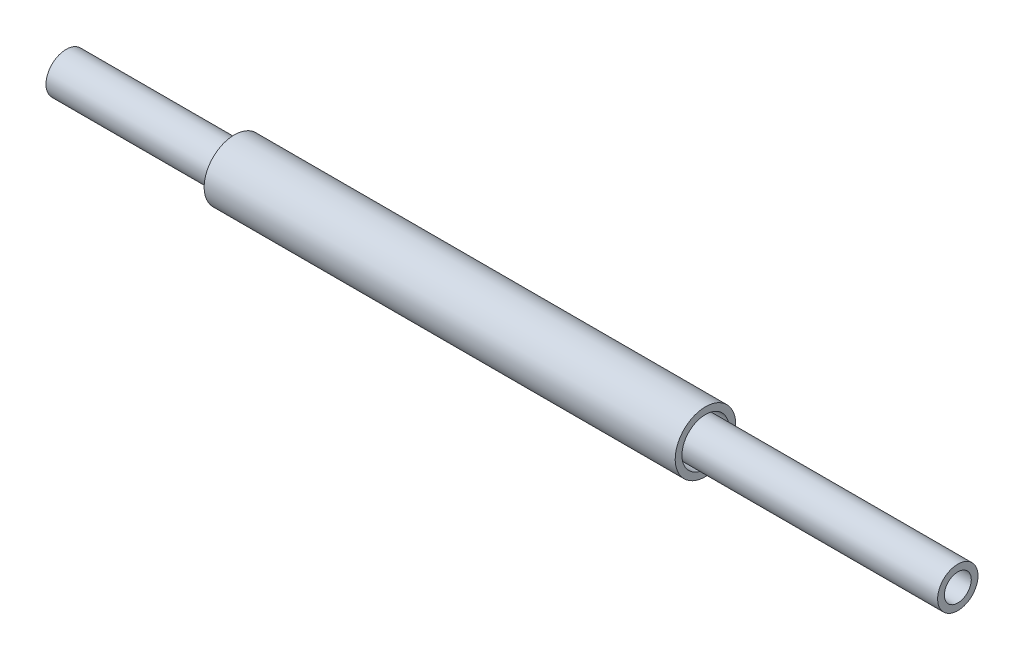
ISO-10303-21;
HEADER;
FILE_DESCRIPTION(('STEP AP214'),'2;1');
FILE_NAME('part.step','',(''),(''),'','','');
FILE_SCHEMA(('AUTOMOTIVE_DESIGN { 1 0 10303 214 1 1 1 1 }'));
ENDSEC;
DATA;
#1=APPLICATION_CONTEXT('core data for automotive mechanical design processes');
#2=APPLICATION_PROTOCOL_DEFINITION('international standard','automotive_design',2000,#1);
#3=PRODUCT_CONTEXT('',#1,'mechanical');
#4=PRODUCT('Part','Part','',(#3));
#5=PRODUCT_RELATED_PRODUCT_CATEGORY('part','',(#4));
#6=PRODUCT_DEFINITION_FORMATION('','',#4);
#7=PRODUCT_DEFINITION_CONTEXT('part definition',#1,'design');
#8=PRODUCT_DEFINITION('design','',#6,#7);
#9=PRODUCT_DEFINITION_SHAPE('','',#8);
#10=(LENGTH_UNIT() NAMED_UNIT(*) SI_UNIT(.MILLI.,.METRE.));
#11=(NAMED_UNIT(*) PLANE_ANGLE_UNIT() SI_UNIT($,.RADIAN.));
#12=(NAMED_UNIT(*) SI_UNIT($,.STERADIAN.) SOLID_ANGLE_UNIT());
#13=UNCERTAINTY_MEASURE_WITH_UNIT(LENGTH_MEASURE(1.E-05),#10,'distance_accuracy_value','');
#14=(GEOMETRIC_REPRESENTATION_CONTEXT(3) GLOBAL_UNCERTAINTY_ASSIGNED_CONTEXT((#13)) GLOBAL_UNIT_ASSIGNED_CONTEXT((#10,
#11,#12)) REPRESENTATION_CONTEXT('',''));
#15=CARTESIAN_POINT('',(0.,0.,0.));
#16=DIRECTION('',(0.,0.,1.));
#17=DIRECTION('',(1.,0.,0.));
#18=AXIS2_PLACEMENT_3D('',#15,#16,#17);
#19=CARTESIAN_POINT('',(0.,0.,0.));
#20=DIRECTION('',(-1.,0.,0.));
#21=DIRECTION('',(0.,0.,1.));
#22=AXIS2_PLACEMENT_3D('',#19,#20,#21);
#23=CYLINDRICAL_SURFACE('',#22,140.);
#24=CARTESIAN_POINT('',(1900.,0.,0.));
#25=DIRECTION('',(-1.,0.,0.));
#26=DIRECTION('',(0.,0.,1.));
#27=AXIS2_PLACEMENT_3D('',#24,#25,#26);
#28=CIRCLE('',#27,140.);
#29=CARTESIAN_POINT('',(1900.,140.,-1.00514204835565E-06));
#30=VERTEX_POINT('',#29);
#31=CARTESIAN_POINT('',(1900.,140.,0.));
#32=VERTEX_POINT('',#31);
#33=EDGE_CURVE('E12',#30,#32,#28,.T.);
#34=ORIENTED_EDGE('',*,*,#33,.T.);
#35=DIRECTION('',(1.,0.,0.));
#36=VECTOR('',#35,1.);
#37=CARTESIAN_POINT('',(4700.,140.,0.));
#38=LINE('',#37,#36);
#39=CARTESIAN_POINT('',(4700.,140.,0.));
#40=VERTEX_POINT('',#39);
#41=EDGE_CURVE('E109',#32,#40,#38,.T.);
#42=ORIENTED_EDGE('',*,*,#41,.T.);
#43=CARTESIAN_POINT('',(4700.,0.,0.));
#44=DIRECTION('',(-1.,0.,0.));
#45=DIRECTION('',(0.,0.,1.));
#46=AXIS2_PLACEMENT_3D('',#43,#44,#45);
#47=CIRCLE('',#46,140.);
#48=CARTESIAN_POINT('',(4700.,140.,-1.00514204835565E-06));
#49=VERTEX_POINT('',#48);
#50=EDGE_CURVE('E87',#49,#40,#47,.T.);
#51=ORIENTED_EDGE('',*,*,#50,.F.);
#52=DIRECTION('',(1.,0.,0.));
#53=VECTOR('',#52,1.);
#54=CARTESIAN_POINT('',(4700.,140.,-1.00514204835565E-06));
#55=LINE('',#54,#53);
#56=EDGE_CURVE('E113',#30,#49,#55,.T.);
#57=ORIENTED_EDGE('',*,*,#56,.F.);
#58=EDGE_LOOP('',(#34,#42,#51,#57));
#59=FACE_BOUND('',#58,.T.);
#60=ADVANCED_FACE('F47',(#59),#23,.F.);
#61=CARTESIAN_POINT('',(1900.,140.,-1.00514204835565E-06));
#62=DIRECTION('',(1.,0.,0.));
#63=DIRECTION('',(0.,0.,-1.));
#64=AXIS2_PLACEMENT_3D('',#61,#62,#63);
#65=PLANE('',#64);
#66=CARTESIAN_POINT('',(1900.,0.,0.));
#67=DIRECTION('',(-1.,0.,0.));
#68=DIRECTION('',(0.,0.,1.));
#69=AXIS2_PLACEMENT_3D('',#66,#67,#68);
#70=CIRCLE('',#69,180.);
#71=CARTESIAN_POINT('',(1900.,180.,-1.29232549074298E-06));
#72=VERTEX_POINT('',#71);
#73=CARTESIAN_POINT('',(1900.,180.,0.));
#74=VERTEX_POINT('',#73);
#75=EDGE_CURVE('E60',#72,#74,#70,.T.);
#76=ORIENTED_EDGE('',*,*,#75,.T.);
#77=DIRECTION('',(0.,-1.,0.));
#78=VECTOR('',#77,1.);
#79=CARTESIAN_POINT('',(1900.,140.,0.));
#80=LINE('',#79,#78);
#81=EDGE_CURVE('E111',#74,#32,#80,.T.);
#82=ORIENTED_EDGE('',*,*,#81,.T.);
#83=ORIENTED_EDGE('',*,*,#33,.F.);
#84=DIRECTION('',(0.,-1.,7.17958605968322E-09));
#85=VECTOR('',#84,1.);
#86=CARTESIAN_POINT('',(1900.,140.,-1.00514204835565E-06));
#87=LINE('',#86,#85);
#88=EDGE_CURVE('E102',#72,#30,#87,.T.);
#89=ORIENTED_EDGE('',*,*,#88,.F.);
#90=EDGE_LOOP('',(#76,#82,#83,#89));
#91=FACE_BOUND('',#90,.T.);
#92=ADVANCED_FACE('F51',(#91),#65,.F.);
#93=CARTESIAN_POINT('',(0.,0.,0.));
#94=DIRECTION('',(-1.,0.,0.));
#95=DIRECTION('',(0.,0.,1.));
#96=AXIS2_PLACEMENT_3D('',#93,#94,#95);
#97=CYLINDRICAL_SURFACE('',#96,180.);
#98=CARTESIAN_POINT('',(4700.,0.,0.));
#99=DIRECTION('',(-1.,0.,0.));
#100=DIRECTION('',(0.,0.,1.));
#101=AXIS2_PLACEMENT_3D('',#98,#99,#100);
#102=CIRCLE('',#101,180.);
#103=CARTESIAN_POINT('',(4700.,180.,-1.29232549074298E-06));
#104=VERTEX_POINT('',#103);
#105=CARTESIAN_POINT('',(4700.,180.,0.));
#106=VERTEX_POINT('',#105);
#107=EDGE_CURVE('E99',#104,#106,#102,.T.);
#108=ORIENTED_EDGE('',*,*,#107,.T.);
#109=DIRECTION('',(-1.,0.,0.));
#110=VECTOR('',#109,1.);
#111=CARTESIAN_POINT('',(1900.,180.,0.));
#112=LINE('',#111,#110);
#113=EDGE_CURVE('E110',#106,#74,#112,.T.);
#114=ORIENTED_EDGE('',*,*,#113,.T.);
#115=ORIENTED_EDGE('',*,*,#75,.F.);
#116=DIRECTION('',(-1.,0.,0.));
#117=VECTOR('',#116,1.);
#118=CARTESIAN_POINT('',(1900.,180.,-1.29232549074298E-06));
#119=LINE('',#118,#117);
#120=EDGE_CURVE('E120',#104,#72,#119,.T.);
#121=ORIENTED_EDGE('',*,*,#120,.F.);
#122=EDGE_LOOP('',(#108,#114,#115,#121));
#123=FACE_BOUND('',#122,.T.);
#124=ADVANCED_FACE('F123',(#123),#97,.T.);
#125=CARTESIAN_POINT('',(4700.,180.,-1.29232549074298E-06));
#126=DIRECTION('',(-1.,0.,0.));
#127=DIRECTION('',(0.,0.,1.));
#128=AXIS2_PLACEMENT_3D('',#125,#126,#127);
#129=PLANE('',#128);
#130=DIRECTION('',(0.,1.,-7.17958605968322E-09));
#131=VECTOR('',#130,1.);
#132=CARTESIAN_POINT('',(4700.,180.,-1.29232549074298E-06));
#133=LINE('',#132,#131);
#134=EDGE_CURVE('E94',#49,#104,#133,.T.);
#135=ORIENTED_EDGE('',*,*,#134,.F.);
#136=ORIENTED_EDGE('',*,*,#50,.T.);
#137=DIRECTION('',(0.,1.,0.));
#138=VECTOR('',#137,1.);
#139=CARTESIAN_POINT('',(4700.,180.,0.));
#140=LINE('',#139,#138);
#141=EDGE_CURVE('E95',#40,#106,#140,.T.);
#142=ORIENTED_EDGE('',*,*,#141,.T.);
#143=ORIENTED_EDGE('',*,*,#107,.F.);
#144=EDGE_LOOP('',(#135,#136,#142,#143));
#145=FACE_BOUND('',#144,.T.);
#146=ADVANCED_FACE('F91',(#145),#129,.F.);
#147=CARTESIAN_POINT('',(0.,0.,0.));
#148=DIRECTION('',(0.,-7.17958605968322E-09,-1.));
#149=DIRECTION('',(-1.,0.,0.));
#150=AXIS2_PLACEMENT_3D('',#147,#148,#149);
#151=PLANE('',#150);
#152=ORIENTED_EDGE('',*,*,#56,.T.);
#153=ORIENTED_EDGE('',*,*,#134,.T.);
#154=ORIENTED_EDGE('',*,*,#120,.T.);
#155=ORIENTED_EDGE('',*,*,#88,.T.);
#156=EDGE_LOOP('',(#152,#153,#154,#155));
#157=FACE_BOUND('',#156,.T.);
#158=ADVANCED_FACE('F121',(#157),#151,.F.);
#159=CARTESIAN_POINT('',(0.,0.,0.));
#160=DIRECTION('',(0.,0.,-1.));
#161=DIRECTION('',(-1.,0.,0.));
#162=AXIS2_PLACEMENT_3D('',#159,#160,#161);
#163=PLANE('',#162);
#164=ORIENTED_EDGE('',*,*,#41,.F.);
#165=ORIENTED_EDGE('',*,*,#81,.F.);
#166=ORIENTED_EDGE('',*,*,#113,.F.);
#167=ORIENTED_EDGE('',*,*,#141,.F.);
#168=EDGE_LOOP('',(#164,#165,#166,#167));
#169=FACE_BOUND('',#168,.T.);
#170=ADVANCED_FACE('F103',(#169),#163,.T.);
#171=CLOSED_SHELL('',(#60,#92,#124,#146,#158,#170));
#172=MANIFOLD_SOLID_BREP('B2',#171);
#173=CARTESIAN_POINT('',(0.,0.,0.));
#174=DIRECTION('',(-1.,0.,0.));
#175=DIRECTION('',(0.,0.,1.));
#176=AXIS2_PLACEMENT_3D('',#173,#174,#175);
#177=CYLINDRICAL_SURFACE('',#176,80.);
#178=CARTESIAN_POINT('',(900.,0.,0.));
#179=DIRECTION('',(-1.,0.,0.));
#180=DIRECTION('',(0.,0.,1.));
#181=AXIS2_PLACEMENT_3D('',#178,#179,#180);
#182=CIRCLE('',#181,80.);
#183=CARTESIAN_POINT('',(900.,80.,-5.74366884774658E-07));
#184=VERTEX_POINT('',#183);
#185=CARTESIAN_POINT('',(900.,80.,0.));
#186=VERTEX_POINT('',#185);
#187=EDGE_CURVE('E50',#184,#186,#182,.T.);
#188=ORIENTED_EDGE('',*,*,#187,.T.);
#189=DIRECTION('',(1.,0.,0.));
#190=VECTOR('',#189,1.);
#191=CARTESIAN_POINT('',(6200.,80.,0.));
#192=LINE('',#191,#190);
#193=CARTESIAN_POINT('',(6200.,80.,0.));
#194=VERTEX_POINT('',#193);
#195=EDGE_CURVE('E221',#186,#194,#192,.T.);
#196=ORIENTED_EDGE('',*,*,#195,.T.);
#197=CARTESIAN_POINT('',(6200.,0.,0.));
#198=DIRECTION('',(-1.,0.,0.));
#199=DIRECTION('',(0.,0.,1.));
#200=AXIS2_PLACEMENT_3D('',#197,#198,#199);
#201=CIRCLE('',#200,80.);
#202=CARTESIAN_POINT('',(6200.,80.,-5.74366884774658E-07));
#203=VERTEX_POINT('',#202);
#204=EDGE_CURVE('E201',#203,#194,#201,.T.);
#205=ORIENTED_EDGE('',*,*,#204,.F.);
#206=DIRECTION('',(1.,0.,0.));
#207=VECTOR('',#206,1.);
#208=CARTESIAN_POINT('',(6200.,80.,-5.74366884774658E-07));
#209=LINE('',#208,#207);
#210=EDGE_CURVE('E227',#184,#203,#209,.T.);
#211=ORIENTED_EDGE('',*,*,#210,.F.);
#212=EDGE_LOOP('',(#188,#196,#205,#211));
#213=FACE_BOUND('',#212,.T.);
#214=ADVANCED_FACE('F165',(#213),#177,.F.);
#215=CARTESIAN_POINT('',(900.,80.,-5.74366884774658E-07));
#216=DIRECTION('',(1.,0.,0.));
#217=DIRECTION('',(0.,0.,-1.));
#218=AXIS2_PLACEMENT_3D('',#215,#216,#217);
#219=PLANE('',#218);
#220=CARTESIAN_POINT('',(900.,0.,0.));
#221=DIRECTION('',(-1.,0.,0.));
#222=DIRECTION('',(0.,0.,1.));
#223=AXIS2_PLACEMENT_3D('',#220,#221,#222);
#224=CIRCLE('',#223,120.);
#225=CARTESIAN_POINT('',(900.,120.,-8.61550327161987E-07));
#226=VERTEX_POINT('',#225);
#227=CARTESIAN_POINT('',(900.,120.,0.));
#228=VERTEX_POINT('',#227);
#229=EDGE_CURVE('E173',#226,#228,#224,.T.);
#230=ORIENTED_EDGE('',*,*,#229,.T.);
#231=DIRECTION('',(0.,-1.,0.));
#232=VECTOR('',#231,1.);
#233=CARTESIAN_POINT('',(900.,80.,0.));
#234=LINE('',#233,#232);
#235=EDGE_CURVE('E230',#228,#186,#234,.T.);
#236=ORIENTED_EDGE('',*,*,#235,.T.);
#237=ORIENTED_EDGE('',*,*,#187,.F.);
#238=DIRECTION('',(0.,-1.,7.17958605968322E-09));
#239=VECTOR('',#238,1.);
#240=CARTESIAN_POINT('',(900.,80.,-5.74366884774658E-07));
#241=LINE('',#240,#239);
#242=EDGE_CURVE('E214',#226,#184,#241,.T.);
#243=ORIENTED_EDGE('',*,*,#242,.F.);
#244=EDGE_LOOP('',(#230,#236,#237,#243));
#245=FACE_BOUND('',#244,.T.);
#246=ADVANCED_FACE('F163',(#245),#219,.F.);
#247=CARTESIAN_POINT('',(0.,0.,0.));
#248=DIRECTION('',(-1.,0.,0.));
#249=DIRECTION('',(0.,0.,1.));
#250=AXIS2_PLACEMENT_3D('',#247,#248,#249);
#251=CYLINDRICAL_SURFACE('',#250,120.);
#252=CARTESIAN_POINT('',(6200.,0.,0.));
#253=DIRECTION('',(-1.,0.,0.));
#254=DIRECTION('',(0.,0.,1.));
#255=AXIS2_PLACEMENT_3D('',#252,#253,#254);
#256=CIRCLE('',#255,120.);
#257=CARTESIAN_POINT('',(6200.,120.,-8.61550327161987E-07));
#258=VERTEX_POINT('',#257);
#259=CARTESIAN_POINT('',(6200.,120.,0.));
#260=VERTEX_POINT('',#259);
#261=EDGE_CURVE('E215',#258,#260,#256,.T.);
#262=ORIENTED_EDGE('',*,*,#261,.T.);
#263=DIRECTION('',(-1.,0.,0.));
#264=VECTOR('',#263,1.);
#265=CARTESIAN_POINT('',(900.,120.,0.));
#266=LINE('',#265,#264);
#267=EDGE_CURVE('E225',#260,#228,#266,.T.);
#268=ORIENTED_EDGE('',*,*,#267,.T.);
#269=ORIENTED_EDGE('',*,*,#229,.F.);
#270=DIRECTION('',(-1.,0.,0.));
#271=VECTOR('',#270,1.);
#272=CARTESIAN_POINT('',(900.,120.,-8.61550327161987E-07));
#273=LINE('',#272,#271);
#274=EDGE_CURVE('E235',#258,#226,#273,.T.);
#275=ORIENTED_EDGE('',*,*,#274,.F.);
#276=EDGE_LOOP('',(#262,#268,#269,#275));
#277=FACE_BOUND('',#276,.T.);
#278=ADVANCED_FACE('F234',(#277),#251,.T.);
#279=CARTESIAN_POINT('',(6200.,120.,-8.61550327161987E-07));
#280=DIRECTION('',(-1.,0.,0.));
#281=DIRECTION('',(0.,0.,1.));
#282=AXIS2_PLACEMENT_3D('',#279,#280,#281);
#283=PLANE('',#282);
#284=DIRECTION('',(0.,1.,-7.17958605968322E-09));
#285=VECTOR('',#284,1.);
#286=CARTESIAN_POINT('',(6200.,120.,-8.61550327161987E-07));
#287=LINE('',#286,#285);
#288=EDGE_CURVE('E206',#203,#258,#287,.T.);
#289=ORIENTED_EDGE('',*,*,#288,.F.);
#290=ORIENTED_EDGE('',*,*,#204,.T.);
#291=DIRECTION('',(0.,1.,0.));
#292=VECTOR('',#291,1.);
#293=CARTESIAN_POINT('',(6200.,120.,0.));
#294=LINE('',#293,#292);
#295=EDGE_CURVE('E207',#194,#260,#294,.T.);
#296=ORIENTED_EDGE('',*,*,#295,.T.);
#297=ORIENTED_EDGE('',*,*,#261,.F.);
#298=EDGE_LOOP('',(#289,#290,#296,#297));
#299=FACE_BOUND('',#298,.T.);
#300=ADVANCED_FACE('F203',(#299),#283,.F.);
#301=CARTESIAN_POINT('',(0.,0.,0.));
#302=DIRECTION('',(0.,-7.17958605968322E-09,-1.));
#303=DIRECTION('',(-1.,0.,0.));
#304=AXIS2_PLACEMENT_3D('',#301,#302,#303);
#305=PLANE('',#304);
#306=ORIENTED_EDGE('',*,*,#210,.T.);
#307=ORIENTED_EDGE('',*,*,#288,.T.);
#308=ORIENTED_EDGE('',*,*,#274,.T.);
#309=ORIENTED_EDGE('',*,*,#242,.T.);
#310=EDGE_LOOP('',(#306,#307,#308,#309));
#311=FACE_BOUND('',#310,.T.);
#312=ADVANCED_FACE('F240',(#311),#305,.F.);
#313=CARTESIAN_POINT('',(0.,0.,0.));
#314=DIRECTION('',(0.,0.,-1.));
#315=DIRECTION('',(-1.,0.,0.));
#316=AXIS2_PLACEMENT_3D('',#313,#314,#315);
#317=PLANE('',#316);
#318=ORIENTED_EDGE('',*,*,#195,.F.);
#319=ORIENTED_EDGE('',*,*,#235,.F.);
#320=ORIENTED_EDGE('',*,*,#267,.F.);
#321=ORIENTED_EDGE('',*,*,#295,.F.);
#322=EDGE_LOOP('',(#318,#319,#320,#321));
#323=FACE_BOUND('',#322,.T.);
#324=ADVANCED_FACE('F219',(#323),#317,.T.);
#325=CLOSED_SHELL('',(#214,#246,#278,#300,#312,#324));
#326=MANIFOLD_SOLID_BREP('B6',#325);
#327=ADVANCED_BREP_SHAPE_REPRESENTATION('',(#18,#172,#326),#14);
#328=SHAPE_DEFINITION_REPRESENTATION(#9,#327);
ENDSEC;
END-ISO-10303-21;
